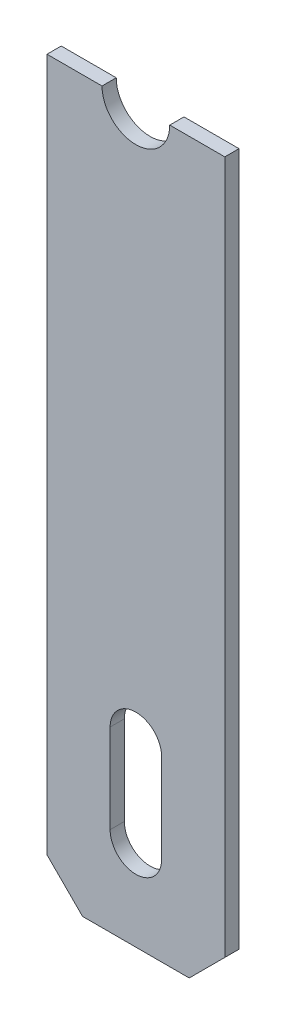
ISO-10303-21;
HEADER;
FILE_DESCRIPTION(('STEP AP214'),'2;1');
FILE_NAME('part.step','',(''),(''),'','','');
FILE_SCHEMA(('AUTOMOTIVE_DESIGN { 1 0 10303 214 1 1 1 1 }'));
ENDSEC;
DATA;
#1=APPLICATION_CONTEXT('core data for automotive mechanical design processes');
#2=APPLICATION_PROTOCOL_DEFINITION('international standard','automotive_design',2000,#1);
#3=PRODUCT_CONTEXT('',#1,'mechanical');
#4=PRODUCT('Part','Part','',(#3));
#5=PRODUCT_RELATED_PRODUCT_CATEGORY('part','',(#4));
#6=PRODUCT_DEFINITION_FORMATION('','',#4);
#7=PRODUCT_DEFINITION_CONTEXT('part definition',#1,'design');
#8=PRODUCT_DEFINITION('design','',#6,#7);
#9=PRODUCT_DEFINITION_SHAPE('','',#8);
#10=(LENGTH_UNIT() NAMED_UNIT(*) SI_UNIT(.MILLI.,.METRE.));
#11=(NAMED_UNIT(*) PLANE_ANGLE_UNIT() SI_UNIT($,.RADIAN.));
#12=(NAMED_UNIT(*) SI_UNIT($,.STERADIAN.) SOLID_ANGLE_UNIT());
#13=UNCERTAINTY_MEASURE_WITH_UNIT(LENGTH_MEASURE(1.E-05),#10,'distance_accuracy_value','');
#14=(GEOMETRIC_REPRESENTATION_CONTEXT(3) GLOBAL_UNCERTAINTY_ASSIGNED_CONTEXT((#13)) GLOBAL_UNIT_ASSIGNED_CONTEXT((#10,
#11,#12)) REPRESENTATION_CONTEXT('',''));
#15=CARTESIAN_POINT('',(0.,0.,0.));
#16=DIRECTION('',(0.,0.,1.));
#17=DIRECTION('',(1.,0.,0.));
#18=AXIS2_PLACEMENT_3D('',#15,#16,#17);
#19=CARTESIAN_POINT('',(0.,90.,4.));
#20=DIRECTION('',(0.,0.,1.));
#21=DIRECTION('',(1.,0.,0.));
#22=AXIS2_PLACEMENT_3D('',#19,#20,#21);
#23=PLANE('',#22);
#24=DIRECTION('',(0.707106781186548,-0.707106781186547,0.));
#25=VECTOR('',#24,1.);
#26=CARTESIAN_POINT('',(-25.,-105.,4.));
#27=LINE('',#26,#25);
#28=CARTESIAN_POINT('',(-25.,-105.,4.));
#29=VERTEX_POINT('',#28);
#30=CARTESIAN_POINT('',(-15.,-115.,4.));
#31=VERTEX_POINT('',#30);
#32=EDGE_CURVE('E177',#29,#31,#27,.T.);
#33=ORIENTED_EDGE('',*,*,#32,.T.);
#34=DIRECTION('',(1.,0.,0.));
#35=VECTOR('',#34,1.);
#36=CARTESIAN_POINT('',(-15.,-115.,4.));
#37=LINE('',#36,#35);
#38=CARTESIAN_POINT('',(15.,-115.,4.));
#39=VERTEX_POINT('',#38);
#40=EDGE_CURVE('E181',#31,#39,#37,.T.);
#41=ORIENTED_EDGE('',*,*,#40,.T.);
#42=DIRECTION('',(0.707106781186548,0.707106781186547,0.));
#43=VECTOR('',#42,1.);
#44=CARTESIAN_POINT('',(15.,-115.,4.));
#45=LINE('',#44,#43);
#46=CARTESIAN_POINT('',(25.,-105.,4.));
#47=VERTEX_POINT('',#46);
#48=EDGE_CURVE('E185',#39,#47,#45,.T.);
#49=ORIENTED_EDGE('',*,*,#48,.T.);
#50=DIRECTION('',(0.,1.,0.));
#51=VECTOR('',#50,1.);
#52=CARTESIAN_POINT('',(25.,-65.,4.));
#53=LINE('',#52,#51);
#54=CARTESIAN_POINT('',(25.,90.,4.));
#55=VERTEX_POINT('',#54);
#56=EDGE_CURVE('E188',#47,#55,#53,.T.);
#57=ORIENTED_EDGE('',*,*,#56,.T.);
#58=DIRECTION('',(-1.,0.,0.));
#59=VECTOR('',#58,1.);
#60=CARTESIAN_POINT('',(9.52499999999997,90.,4.));
#61=LINE('',#60,#59);
#62=CARTESIAN_POINT('',(9.52499999999997,90.,4.));
#63=VERTEX_POINT('',#62);
#64=EDGE_CURVE('E191',#55,#63,#61,.T.);
#65=ORIENTED_EDGE('',*,*,#64,.T.);
#66=CARTESIAN_POINT('',(0.,90.,4.));
#67=DIRECTION('',(0.,0.,-1.));
#68=DIRECTION('',(1.,0.,0.));
#69=AXIS2_PLACEMENT_3D('',#66,#67,#68);
#70=CIRCLE('',#69,9.525);
#71=CARTESIAN_POINT('',(-9.52500000000003,90.,4.));
#72=VERTEX_POINT('',#71);
#73=EDGE_CURVE('E194',#63,#72,#70,.T.);
#74=ORIENTED_EDGE('',*,*,#73,.T.);
#75=DIRECTION('',(-1.,0.,0.));
#76=VECTOR('',#75,1.);
#77=CARTESIAN_POINT('',(-25.,90.,4.));
#78=LINE('',#77,#76);
#79=CARTESIAN_POINT('',(-25.,90.,4.));
#80=VERTEX_POINT('',#79);
#81=EDGE_CURVE('E197',#72,#80,#78,.T.);
#82=ORIENTED_EDGE('',*,*,#81,.T.);
#83=DIRECTION('',(0.,-1.,0.));
#84=VECTOR('',#83,1.);
#85=CARTESIAN_POINT('',(-25.,-65.0000000000001,4.));
#86=LINE('',#85,#84);
#87=EDGE_CURVE('E200',#80,#29,#86,.T.);
#88=ORIENTED_EDGE('',*,*,#87,.T.);
#89=EDGE_LOOP('',(#33,#41,#49,#57,#65,#74,#82,#88));
#90=FACE_BOUND('',#89,.T.);
#91=DIRECTION('',(0.,1.,0.));
#92=VECTOR('',#91,1.);
#93=CARTESIAN_POINT('',(7.25000000000002,-90.,4.));
#94=LINE('',#93,#92);
#95=CARTESIAN_POINT('',(7.25000000000002,-90.,4.));
#96=VERTEX_POINT('',#95);
#97=CARTESIAN_POINT('',(7.25000000000002,-65.,4.));
#98=VERTEX_POINT('',#97);
#99=EDGE_CURVE('E138',#96,#98,#94,.T.);
#100=ORIENTED_EDGE('',*,*,#99,.F.);
#101=CARTESIAN_POINT('',(0.,-90.,4.));
#102=DIRECTION('',(0.,0.,1.));
#103=DIRECTION('',(1.,0.,0.));
#104=AXIS2_PLACEMENT_3D('',#101,#102,#103);
#105=CIRCLE('',#104,7.25);
#106=CARTESIAN_POINT('',(-7.24999999999998,-90.,4.));
#107=VERTEX_POINT('',#106);
#108=EDGE_CURVE('E129',#107,#96,#105,.T.);
#109=ORIENTED_EDGE('',*,*,#108,.F.);
#110=DIRECTION('',(0.,-1.,0.));
#111=VECTOR('',#110,1.);
#112=CARTESIAN_POINT('',(-7.24999999999998,-90.,4.));
#113=LINE('',#112,#111);
#114=CARTESIAN_POINT('',(-7.24999999999998,-65.,4.));
#115=VERTEX_POINT('',#114);
#116=EDGE_CURVE('E155',#115,#107,#113,.T.);
#117=ORIENTED_EDGE('',*,*,#116,.F.);
#118=CARTESIAN_POINT('',(0.,-65.,4.));
#119=DIRECTION('',(0.,0.,1.));
#120=DIRECTION('',(1.,0.,0.));
#121=AXIS2_PLACEMENT_3D('',#118,#119,#120);
#122=CIRCLE('',#121,7.25);
#123=EDGE_CURVE('E151',#98,#115,#122,.T.);
#124=ORIENTED_EDGE('',*,*,#123,.F.);
#125=EDGE_LOOP('',(#100,#109,#117,#124));
#126=FACE_BOUND('',#125,.T.);
#127=ADVANCED_FACE('F39',(#90,#126),#23,.T.);
#128=CARTESIAN_POINT('',(0.,90.,0.));
#129=DIRECTION('',(0.,0.,1.));
#130=DIRECTION('',(1.,0.,0.));
#131=AXIS2_PLACEMENT_3D('',#128,#129,#130);
#132=PLANE('',#131);
#133=DIRECTION('',(0.707106781186548,-0.707106781186547,0.));
#134=VECTOR('',#133,1.);
#135=CARTESIAN_POINT('',(-25.,-105.,0.));
#136=LINE('',#135,#134);
#137=CARTESIAN_POINT('',(-25.,-105.,0.));
#138=VERTEX_POINT('',#137);
#139=CARTESIAN_POINT('',(-15.,-115.,0.));
#140=VERTEX_POINT('',#139);
#141=EDGE_CURVE('E147',#138,#140,#136,.T.);
#142=ORIENTED_EDGE('',*,*,#141,.F.);
#143=DIRECTION('',(0.,-1.,0.));
#144=VECTOR('',#143,1.);
#145=CARTESIAN_POINT('',(-25.,-65.0000000000001,0.));
#146=LINE('',#145,#144);
#147=CARTESIAN_POINT('',(-25.,90.,0.));
#148=VERTEX_POINT('',#147);
#149=EDGE_CURVE('E182',#148,#138,#146,.T.);
#150=ORIENTED_EDGE('',*,*,#149,.F.);
#151=DIRECTION('',(-1.,0.,0.));
#152=VECTOR('',#151,1.);
#153=CARTESIAN_POINT('',(-25.,90.,0.));
#154=LINE('',#153,#152);
#155=CARTESIAN_POINT('',(-9.52500000000003,90.,0.));
#156=VERTEX_POINT('',#155);
#157=EDGE_CURVE('E223',#156,#148,#154,.T.);
#158=ORIENTED_EDGE('',*,*,#157,.F.);
#159=CARTESIAN_POINT('',(0.,90.,0.));
#160=DIRECTION('',(0.,0.,-1.));
#161=DIRECTION('',(1.,0.,0.));
#162=AXIS2_PLACEMENT_3D('',#159,#160,#161);
#163=CIRCLE('',#162,9.525);
#164=CARTESIAN_POINT('',(9.52499999999997,90.,0.));
#165=VERTEX_POINT('',#164);
#166=EDGE_CURVE('E220',#165,#156,#163,.T.);
#167=ORIENTED_EDGE('',*,*,#166,.F.);
#168=DIRECTION('',(-1.,0.,0.));
#169=VECTOR('',#168,1.);
#170=CARTESIAN_POINT('',(9.52499999999997,90.,0.));
#171=LINE('',#170,#169);
#172=CARTESIAN_POINT('',(25.,90.,0.));
#173=VERTEX_POINT('',#172);
#174=EDGE_CURVE('E217',#173,#165,#171,.T.);
#175=ORIENTED_EDGE('',*,*,#174,.F.);
#176=DIRECTION('',(0.,1.,0.));
#177=VECTOR('',#176,1.);
#178=CARTESIAN_POINT('',(25.,90.,0.));
#179=LINE('',#178,#177);
#180=CARTESIAN_POINT('',(25.,-105.,0.));
#181=VERTEX_POINT('',#180);
#182=EDGE_CURVE('E214',#181,#173,#179,.T.);
#183=ORIENTED_EDGE('',*,*,#182,.F.);
#184=DIRECTION('',(0.707106781186548,0.707106781186547,0.));
#185=VECTOR('',#184,1.);
#186=CARTESIAN_POINT('',(15.,-115.,0.));
#187=LINE('',#186,#185);
#188=CARTESIAN_POINT('',(15.,-115.,0.));
#189=VERTEX_POINT('',#188);
#190=EDGE_CURVE('E210',#189,#181,#187,.T.);
#191=ORIENTED_EDGE('',*,*,#190,.F.);
#192=DIRECTION('',(1.,0.,0.));
#193=VECTOR('',#192,1.);
#194=CARTESIAN_POINT('',(-15.,-115.,0.));
#195=LINE('',#194,#193);
#196=EDGE_CURVE('E207',#140,#189,#195,.T.);
#197=ORIENTED_EDGE('',*,*,#196,.F.);
#198=EDGE_LOOP('',(#142,#150,#158,#167,#175,#183,#191,#197));
#199=FACE_BOUND('',#198,.T.);
#200=CARTESIAN_POINT('',(0.,-90.,0.));
#201=DIRECTION('',(0.,0.,1.));
#202=DIRECTION('',(1.,0.,0.));
#203=AXIS2_PLACEMENT_3D('',#200,#201,#202);
#204=CIRCLE('',#203,7.25);
#205=CARTESIAN_POINT('',(-7.24999999999998,-90.,0.));
#206=VERTEX_POINT('',#205);
#207=CARTESIAN_POINT('',(7.25000000000002,-90.,0.));
#208=VERTEX_POINT('',#207);
#209=EDGE_CURVE('E63',#206,#208,#204,.T.);
#210=ORIENTED_EDGE('',*,*,#209,.T.);
#211=DIRECTION('',(0.,1.,0.));
#212=VECTOR('',#211,1.);
#213=CARTESIAN_POINT('',(7.25000000000002,-90.,0.));
#214=LINE('',#213,#212);
#215=CARTESIAN_POINT('',(7.25000000000002,-65.,0.));
#216=VERTEX_POINT('',#215);
#217=EDGE_CURVE('E145',#208,#216,#214,.T.);
#218=ORIENTED_EDGE('',*,*,#217,.T.);
#219=CARTESIAN_POINT('',(0.,-65.,0.));
#220=DIRECTION('',(0.,0.,1.));
#221=DIRECTION('',(1.,0.,0.));
#222=AXIS2_PLACEMENT_3D('',#219,#220,#221);
#223=CIRCLE('',#222,7.25);
#224=CARTESIAN_POINT('',(-7.24999999999998,-65.,0.));
#225=VERTEX_POINT('',#224);
#226=EDGE_CURVE('E164',#216,#225,#223,.T.);
#227=ORIENTED_EDGE('',*,*,#226,.T.);
#228=DIRECTION('',(0.,-1.,0.));
#229=VECTOR('',#228,1.);
#230=CARTESIAN_POINT('',(-7.24999999999998,-90.,0.));
#231=LINE('',#230,#229);
#232=EDGE_CURVE('E139',#225,#206,#231,.T.);
#233=ORIENTED_EDGE('',*,*,#232,.T.);
#234=EDGE_LOOP('',(#210,#218,#227,#233));
#235=FACE_BOUND('',#234,.T.);
#236=ADVANCED_FACE('F262',(#199,#235),#132,.F.);
#237=CARTESIAN_POINT('',(-25.,-105.,4.));
#238=DIRECTION('',(0.707106781186547,0.707106781186548,0.));
#239=DIRECTION('',(-0.707106781186548,0.707106781186547,0.));
#240=AXIS2_PLACEMENT_3D('',#237,#238,#239);
#241=PLANE('',#240);
#242=ORIENTED_EDGE('',*,*,#141,.T.);
#243=DIRECTION('',(0.,0.,-1.));
#244=VECTOR('',#243,1.);
#245=CARTESIAN_POINT('',(-15.,-115.,4.));
#246=LINE('',#245,#244);
#247=EDGE_CURVE('E11',#31,#140,#246,.T.);
#248=ORIENTED_EDGE('',*,*,#247,.F.);
#249=ORIENTED_EDGE('',*,*,#32,.F.);
#250=DIRECTION('',(0.,0.,-1.));
#251=VECTOR('',#250,1.);
#252=CARTESIAN_POINT('',(-25.,-105.,4.));
#253=LINE('',#252,#251);
#254=EDGE_CURVE('E203',#29,#138,#253,.T.);
#255=ORIENTED_EDGE('',*,*,#254,.T.);
#256=EDGE_LOOP('',(#242,#248,#249,#255));
#257=FACE_BOUND('',#256,.T.);
#258=ADVANCED_FACE('F41',(#257),#241,.F.);
#259=CARTESIAN_POINT('',(-15.,-115.,4.));
#260=DIRECTION('',(0.,1.,0.));
#261=DIRECTION('',(0.,0.,1.));
#262=AXIS2_PLACEMENT_3D('',#259,#260,#261);
#263=PLANE('',#262);
#264=ORIENTED_EDGE('',*,*,#196,.T.);
#265=DIRECTION('',(0.,0.,-1.));
#266=VECTOR('',#265,1.);
#267=CARTESIAN_POINT('',(15.,-115.,4.));
#268=LINE('',#267,#266);
#269=EDGE_CURVE('E48',#39,#189,#268,.T.);
#270=ORIENTED_EDGE('',*,*,#269,.F.);
#271=ORIENTED_EDGE('',*,*,#40,.F.);
#272=ORIENTED_EDGE('',*,*,#247,.T.);
#273=EDGE_LOOP('',(#264,#270,#271,#272));
#274=FACE_BOUND('',#273,.T.);
#275=ADVANCED_FACE('F279',(#274),#263,.F.);
#276=CARTESIAN_POINT('',(15.,-115.,4.));
#277=DIRECTION('',(-0.707106781186547,0.707106781186548,0.));
#278=DIRECTION('',(-0.707106781186548,-0.707106781186547,0.));
#279=AXIS2_PLACEMENT_3D('',#276,#277,#278);
#280=PLANE('',#279);
#281=ORIENTED_EDGE('',*,*,#190,.T.);
#282=DIRECTION('',(0.,0.,-1.));
#283=VECTOR('',#282,1.);
#284=CARTESIAN_POINT('',(25.,-105.,4.));
#285=LINE('',#284,#283);
#286=EDGE_CURVE('E248',#47,#181,#285,.T.);
#287=ORIENTED_EDGE('',*,*,#286,.F.);
#288=ORIENTED_EDGE('',*,*,#48,.F.);
#289=ORIENTED_EDGE('',*,*,#269,.T.);
#290=EDGE_LOOP('',(#281,#287,#288,#289));
#291=FACE_BOUND('',#290,.T.);
#292=ADVANCED_FACE('F257',(#291),#280,.F.);
#293=CARTESIAN_POINT('',(25.,90.,4.));
#294=DIRECTION('',(-1.,0.,0.));
#295=DIRECTION('',(0.,0.,1.));
#296=AXIS2_PLACEMENT_3D('',#293,#294,#295);
#297=PLANE('',#296);
#298=ORIENTED_EDGE('',*,*,#182,.T.);
#299=DIRECTION('',(0.,0.,-1.));
#300=VECTOR('',#299,1.);
#301=CARTESIAN_POINT('',(25.,90.,4.));
#302=LINE('',#301,#300);
#303=EDGE_CURVE('E244',#55,#173,#302,.T.);
#304=ORIENTED_EDGE('',*,*,#303,.F.);
#305=ORIENTED_EDGE('',*,*,#56,.F.);
#306=ORIENTED_EDGE('',*,*,#286,.T.);
#307=EDGE_LOOP('',(#298,#304,#305,#306));
#308=FACE_BOUND('',#307,.T.);
#309=ADVANCED_FACE('F268',(#308),#297,.F.);
#310=CARTESIAN_POINT('',(9.52499999999997,90.,4.));
#311=DIRECTION('',(0.,-1.,0.));
#312=DIRECTION('',(0.,0.,-1.));
#313=AXIS2_PLACEMENT_3D('',#310,#311,#312);
#314=PLANE('',#313);
#315=ORIENTED_EDGE('',*,*,#174,.T.);
#316=DIRECTION('',(0.,0.,-1.));
#317=VECTOR('',#316,1.);
#318=CARTESIAN_POINT('',(9.52499999999997,90.,4.));
#319=LINE('',#318,#317);
#320=EDGE_CURVE('E240',#63,#165,#319,.T.);
#321=ORIENTED_EDGE('',*,*,#320,.F.);
#322=ORIENTED_EDGE('',*,*,#64,.F.);
#323=ORIENTED_EDGE('',*,*,#303,.T.);
#324=EDGE_LOOP('',(#315,#321,#322,#323));
#325=FACE_BOUND('',#324,.T.);
#326=ADVANCED_FACE('F272',(#325),#314,.F.);
#327=CARTESIAN_POINT('',(0.,90.,4.));
#328=DIRECTION('',(0.,0.,-1.));
#329=DIRECTION('',(-1.,0.,0.));
#330=AXIS2_PLACEMENT_3D('',#327,#328,#329);
#331=CYLINDRICAL_SURFACE('',#330,9.525);
#332=ORIENTED_EDGE('',*,*,#166,.T.);
#333=DIRECTION('',(0.,0.,-1.));
#334=VECTOR('',#333,1.);
#335=CARTESIAN_POINT('',(-9.52500000000003,90.,4.));
#336=LINE('',#335,#334);
#337=EDGE_CURVE('E236',#72,#156,#336,.T.);
#338=ORIENTED_EDGE('',*,*,#337,.F.);
#339=ORIENTED_EDGE('',*,*,#73,.F.);
#340=ORIENTED_EDGE('',*,*,#320,.T.);
#341=EDGE_LOOP('',(#332,#338,#339,#340));
#342=FACE_BOUND('',#341,.T.);
#343=ADVANCED_FACE('F297',(#342),#331,.F.);
#344=CARTESIAN_POINT('',(-25.,90.,4.));
#345=DIRECTION('',(0.,-1.,0.));
#346=DIRECTION('',(0.,0.,-1.));
#347=AXIS2_PLACEMENT_3D('',#344,#345,#346);
#348=PLANE('',#347);
#349=ORIENTED_EDGE('',*,*,#157,.T.);
#350=DIRECTION('',(0.,0.,-1.));
#351=VECTOR('',#350,1.);
#352=CARTESIAN_POINT('',(-25.,90.,4.));
#353=LINE('',#352,#351);
#354=EDGE_CURVE('E232',#80,#148,#353,.T.);
#355=ORIENTED_EDGE('',*,*,#354,.F.);
#356=ORIENTED_EDGE('',*,*,#81,.F.);
#357=ORIENTED_EDGE('',*,*,#337,.T.);
#358=EDGE_LOOP('',(#349,#355,#356,#357));
#359=FACE_BOUND('',#358,.T.);
#360=ADVANCED_FACE('F286',(#359),#348,.F.);
#361=CARTESIAN_POINT('',(-25.,-65.0000000000001,4.));
#362=DIRECTION('',(1.,0.,0.));
#363=DIRECTION('',(0.,1.,0.));
#364=AXIS2_PLACEMENT_3D('',#361,#362,#363);
#365=PLANE('',#364);
#366=ORIENTED_EDGE('',*,*,#149,.T.);
#367=ORIENTED_EDGE('',*,*,#254,.F.);
#368=ORIENTED_EDGE('',*,*,#87,.F.);
#369=ORIENTED_EDGE('',*,*,#354,.T.);
#370=EDGE_LOOP('',(#366,#367,#368,#369));
#371=FACE_BOUND('',#370,.T.);
#372=ADVANCED_FACE('F289',(#371),#365,.F.);
#373=CARTESIAN_POINT('',(0.,-90.,4.));
#374=DIRECTION('',(0.,0.,-1.));
#375=DIRECTION('',(-1.,0.,0.));
#376=AXIS2_PLACEMENT_3D('',#373,#374,#375);
#377=CYLINDRICAL_SURFACE('',#376,7.25);
#378=ORIENTED_EDGE('',*,*,#209,.F.);
#379=DIRECTION('',(0.,0.,-1.));
#380=VECTOR('',#379,1.);
#381=CARTESIAN_POINT('',(-7.24999999999998,-90.,4.));
#382=LINE('',#381,#380);
#383=EDGE_CURVE('E133',#107,#206,#382,.T.);
#384=ORIENTED_EDGE('',*,*,#383,.F.);
#385=ORIENTED_EDGE('',*,*,#108,.T.);
#386=DIRECTION('',(0.,0.,-1.));
#387=VECTOR('',#386,1.);
#388=CARTESIAN_POINT('',(7.25000000000002,-90.,4.));
#389=LINE('',#388,#387);
#390=EDGE_CURVE('E132',#96,#208,#389,.T.);
#391=ORIENTED_EDGE('',*,*,#390,.T.);
#392=EDGE_LOOP('',(#378,#384,#385,#391));
#393=FACE_BOUND('',#392,.T.);
#394=ADVANCED_FACE('F131',(#393),#377,.F.);
#395=CARTESIAN_POINT('',(7.25000000000002,-90.,4.));
#396=DIRECTION('',(-1.,0.,0.));
#397=DIRECTION('',(0.,-1.,0.));
#398=AXIS2_PLACEMENT_3D('',#395,#396,#397);
#399=PLANE('',#398);
#400=ORIENTED_EDGE('',*,*,#217,.F.);
#401=ORIENTED_EDGE('',*,*,#390,.F.);
#402=ORIENTED_EDGE('',*,*,#99,.T.);
#403=DIRECTION('',(0.,0.,-1.));
#404=VECTOR('',#403,1.);
#405=CARTESIAN_POINT('',(7.25000000000002,-65.,4.));
#406=LINE('',#405,#404);
#407=EDGE_CURVE('E148',#98,#216,#406,.T.);
#408=ORIENTED_EDGE('',*,*,#407,.T.);
#409=EDGE_LOOP('',(#400,#401,#402,#408));
#410=FACE_BOUND('',#409,.T.);
#411=ADVANCED_FACE('F142',(#410),#399,.T.);
#412=CARTESIAN_POINT('',(0.,-65.,4.));
#413=DIRECTION('',(0.,0.,-1.));
#414=DIRECTION('',(-1.,0.,0.));
#415=AXIS2_PLACEMENT_3D('',#412,#413,#414);
#416=CYLINDRICAL_SURFACE('',#415,7.25);
#417=ORIENTED_EDGE('',*,*,#226,.F.);
#418=ORIENTED_EDGE('',*,*,#407,.F.);
#419=ORIENTED_EDGE('',*,*,#123,.T.);
#420=DIRECTION('',(0.,0.,-1.));
#421=VECTOR('',#420,1.);
#422=CARTESIAN_POINT('',(-7.24999999999998,-65.,4.));
#423=LINE('',#422,#421);
#424=EDGE_CURVE('E55',#115,#225,#423,.T.);
#425=ORIENTED_EDGE('',*,*,#424,.T.);
#426=EDGE_LOOP('',(#417,#418,#419,#425));
#427=FACE_BOUND('',#426,.T.);
#428=ADVANCED_FACE('F308',(#427),#416,.F.);
#429=CARTESIAN_POINT('',(-7.24999999999998,-90.,4.));
#430=DIRECTION('',(1.,0.,0.));
#431=DIRECTION('',(0.,1.,0.));
#432=AXIS2_PLACEMENT_3D('',#429,#430,#431);
#433=PLANE('',#432);
#434=ORIENTED_EDGE('',*,*,#232,.F.);
#435=ORIENTED_EDGE('',*,*,#424,.F.);
#436=ORIENTED_EDGE('',*,*,#116,.T.);
#437=ORIENTED_EDGE('',*,*,#383,.T.);
#438=EDGE_LOOP('',(#434,#435,#436,#437));
#439=FACE_BOUND('',#438,.T.);
#440=ADVANCED_FACE('F311',(#439),#433,.T.);
#441=CLOSED_SHELL('',(#127,#236,#258,#275,#292,#309,#326,#343,#360,#372,#394,#411,#428,#440));
#442=MANIFOLD_SOLID_BREP('B2',#441);
#443=ADVANCED_BREP_SHAPE_REPRESENTATION('',(#18,#442),#14);
#444=SHAPE_DEFINITION_REPRESENTATION(#9,#443);
ENDSEC;
END-ISO-10303-21;
